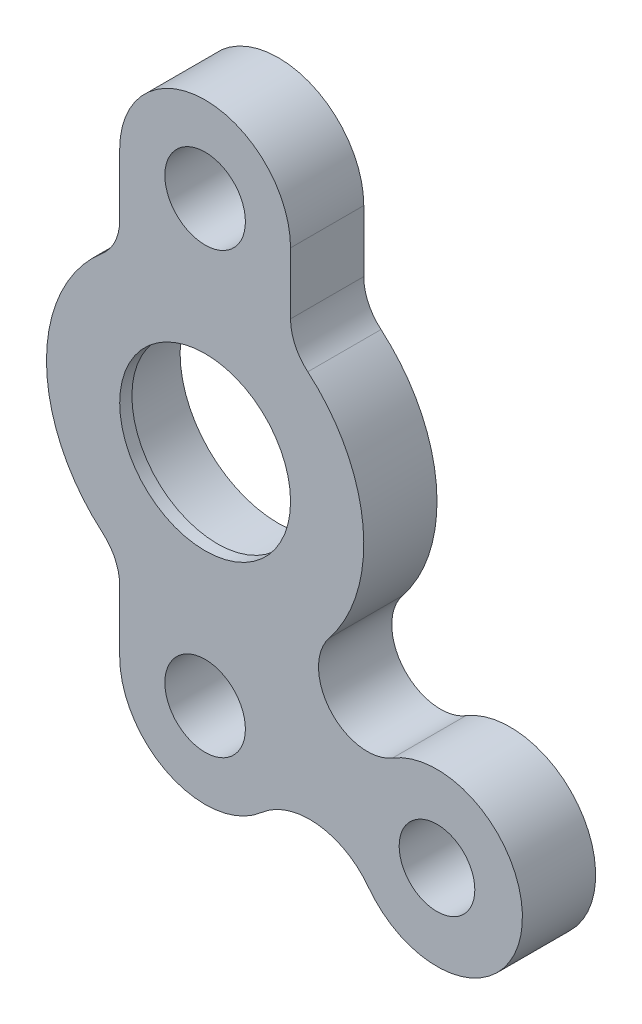
ISO-10303-21;
HEADER;
FILE_DESCRIPTION(('STEP AP214'),'2;1');
FILE_NAME('part.step','',(''),(''),'','','');
FILE_SCHEMA(('AUTOMOTIVE_DESIGN { 1 0 10303 214 1 1 1 1 }'));
ENDSEC;
DATA;
#1=APPLICATION_CONTEXT('core data for automotive mechanical design processes');
#2=APPLICATION_PROTOCOL_DEFINITION('international standard','automotive_design',2000,#1);
#3=PRODUCT_CONTEXT('',#1,'mechanical');
#4=PRODUCT('Part','Part','',(#3));
#5=PRODUCT_RELATED_PRODUCT_CATEGORY('part','',(#4));
#6=PRODUCT_DEFINITION_FORMATION('','',#4);
#7=PRODUCT_DEFINITION_CONTEXT('part definition',#1,'design');
#8=PRODUCT_DEFINITION('design','',#6,#7);
#9=PRODUCT_DEFINITION_SHAPE('','',#8);
#10=(LENGTH_UNIT() NAMED_UNIT(*) SI_UNIT(.MILLI.,.METRE.));
#11=(NAMED_UNIT(*) PLANE_ANGLE_UNIT() SI_UNIT($,.RADIAN.));
#12=(NAMED_UNIT(*) SI_UNIT($,.STERADIAN.) SOLID_ANGLE_UNIT());
#13=UNCERTAINTY_MEASURE_WITH_UNIT(LENGTH_MEASURE(1.E-05),#10,'distance_accuracy_value','');
#14=(GEOMETRIC_REPRESENTATION_CONTEXT(3) GLOBAL_UNCERTAINTY_ASSIGNED_CONTEXT((#13)) GLOBAL_UNIT_ASSIGNED_CONTEXT((#10,
#11,#12)) REPRESENTATION_CONTEXT('',''));
#15=CARTESIAN_POINT('',(0.,0.,0.));
#16=DIRECTION('',(0.,0.,1.));
#17=DIRECTION('',(1.,0.,0.));
#18=AXIS2_PLACEMENT_3D('',#15,#16,#17);
#19=CARTESIAN_POINT('',(0.,0.,29.));
#20=DIRECTION('',(0.,0.,-1.));
#21=DIRECTION('',(-1.,0.,0.));
#22=AXIS2_PLACEMENT_3D('',#19,#20,#21);
#23=CYLINDRICAL_SURFACE('',#22,3.5);
#24=CARTESIAN_POINT('',(0.,0.,28.5));
#25=DIRECTION('',(0.,0.,1.));
#26=DIRECTION('',(0.,-1.,0.));
#27=AXIS2_PLACEMENT_3D('',#24,#25,#26);
#28=CIRCLE('',#27,3.5);
#29=CARTESIAN_POINT('',(0.,-3.5,28.5));
#30=VERTEX_POINT('',#29);
#31=EDGE_CURVE('E210',#30,#30,#28,.T.);
#32=ORIENTED_EDGE('',*,*,#31,.T.);
#33=EDGE_LOOP('',(#32));
#34=FACE_BOUND('',#33,.T.);
#35=CARTESIAN_POINT('',(0.,0.,28.));
#36=DIRECTION('',(0.,0.,-1.));
#37=DIRECTION('',(0.,1.,0.));
#38=AXIS2_PLACEMENT_3D('',#35,#36,#37);
#39=CIRCLE('',#38,3.5);
#40=CARTESIAN_POINT('',(0.,3.5,28.));
#41=VERTEX_POINT('',#40);
#42=EDGE_CURVE('E133',#41,#41,#39,.T.);
#43=ORIENTED_EDGE('',*,*,#42,.T.);
#44=EDGE_LOOP('',(#43));
#45=FACE_BOUND('',#44,.T.);
#46=ADVANCED_FACE('F17',(#34,#45),#23,.F.);
#47=CARTESIAN_POINT('',(-23.2,41.4152455943007,25.5));
#48=DIRECTION('',(0.,0.,-1.));
#49=DIRECTION('',(-1.,0.,0.));
#50=AXIS2_PLACEMENT_3D('',#47,#48,#49);
#51=PLANE('',#50);
#52=CARTESIAN_POINT('',(9.5,-10.,25.5));
#53=DIRECTION('',(0.,0.,-1.));
#54=DIRECTION('',(-1.,0.,0.));
#55=AXIS2_PLACEMENT_3D('',#52,#53,#54);
#56=CIRCLE('',#55,1.55);
#57=CARTESIAN_POINT('',(7.95,-10.,25.5));
#58=VERTEX_POINT('',#57);
#59=EDGE_CURVE('E349',#58,#58,#56,.F.);
#60=ORIENTED_EDGE('',*,*,#59,.T.);
#61=EDGE_LOOP('',(#60));
#62=FACE_BOUND('',#61,.T.);
#63=CARTESIAN_POINT('',(0.,0.,25.5));
#64=DIRECTION('',(0.,0.,-1.));
#65=DIRECTION('',(0.,1.,0.));
#66=AXIS2_PLACEMENT_3D('',#63,#64,#65);
#67=CIRCLE('',#66,4.025);
#68=CARTESIAN_POINT('',(0.,4.025,25.5));
#69=VERTEX_POINT('',#68);
#70=EDGE_CURVE('E139',#69,#69,#67,.T.);
#71=ORIENTED_EDGE('',*,*,#70,.F.);
#72=EDGE_LOOP('',(#71));
#73=FACE_BOUND('',#72,.T.);
#74=CARTESIAN_POINT('',(0.,9.,25.5));
#75=DIRECTION('',(0.,0.,-1.));
#76=DIRECTION('',(-1.,0.,0.));
#77=AXIS2_PLACEMENT_3D('',#74,#75,#76);
#78=CIRCLE('',#77,3.5);
#79=CARTESIAN_POINT('',(3.5,9.,25.5));
#80=VERTEX_POINT('',#79);
#81=CARTESIAN_POINT('',(-3.5,9.,25.5));
#82=VERTEX_POINT('',#81);
#83=EDGE_CURVE('E119',#80,#82,#78,.F.);
#84=ORIENTED_EDGE('',*,*,#83,.F.);
#85=DIRECTION('',(0.,1.,0.));
#86=VECTOR('',#85,1.);
#87=CARTESIAN_POINT('',(3.5,41.4152455943007,25.5));
#88=LINE('',#87,#86);
#89=CARTESIAN_POINT('',(3.5,6.48074069840786,25.5));
#90=VERTEX_POINT('',#89);
#91=EDGE_CURVE('E120',#90,#80,#88,.T.);
#92=ORIENTED_EDGE('',*,*,#91,.F.);
#93=CARTESIAN_POINT('',(5.5,6.48074069840786,25.5));
#94=DIRECTION('',(0.,0.,-1.));
#95=DIRECTION('',(-1.,0.,0.));
#96=AXIS2_PLACEMENT_3D('',#93,#94,#95);
#97=CIRCLE('',#96,2.);
#98=CARTESIAN_POINT('',(4.20588235294118,4.9558605340766,25.5));
#99=VERTEX_POINT('',#98);
#100=EDGE_CURVE('E227',#90,#99,#97,.F.);
#101=ORIENTED_EDGE('',*,*,#100,.T.);
#102=CARTESIAN_POINT('',(0.,0.,25.5));
#103=DIRECTION('',(0.,0.,-1.));
#104=DIRECTION('',(-1.,0.,0.));
#105=AXIS2_PLACEMENT_3D('',#102,#103,#104);
#106=CIRCLE('',#105,6.5);
#107=CARTESIAN_POINT('',(5.08304178098432,-4.05125736688843,25.5));
#108=VERTEX_POINT('',#107);
#109=EDGE_CURVE('E179',#108,#99,#106,.F.);
#110=ORIENTED_EDGE('',*,*,#109,.F.);
#111=CARTESIAN_POINT('',(6.64705463667181,-5.29779809516178,25.5));
#112=DIRECTION('',(0.,0.,-1.));
#113=DIRECTION('',(-1.,0.,0.));
#114=AXIS2_PLACEMENT_3D('',#111,#112,#113);
#115=CIRCLE('',#114,2.);
#116=CARTESIAN_POINT('',(7.6844893142457,-7.00768969692114,25.5));
#117=VERTEX_POINT('',#116);
#118=EDGE_CURVE('E182',#117,#108,#115,.T.);
#119=ORIENTED_EDGE('',*,*,#118,.F.);
#120=CARTESIAN_POINT('',(9.5,-10.,25.5));
#121=DIRECTION('',(0.,0.,-1.));
#122=DIRECTION('',(-1.,0.,0.));
#123=AXIS2_PLACEMENT_3D('',#120,#121,#122);
#124=CIRCLE('',#123,3.5);
#125=CARTESIAN_POINT('',(6.69378934642177,-12.0916935166855,25.5));
#126=VERTEX_POINT('',#125);
#127=EDGE_CURVE('E184',#126,#117,#124,.F.);
#128=ORIENTED_EDGE('',*,*,#127,.F.);
#129=CARTESIAN_POINT('',(4.28846592906901,-13.8845736738445,25.5));
#130=DIRECTION('',(0.,0.,-1.));
#131=DIRECTION('',(-1.,0.,0.));
#132=AXIS2_PLACEMENT_3D('',#129,#130,#131);
#133=CIRCLE('',#132,3.);
#134=CARTESIAN_POINT('',(2.30917396180639,-11.630155055147,25.5));
#135=VERTEX_POINT('',#134);
#136=EDGE_CURVE('E186',#135,#126,#133,.T.);
#137=ORIENTED_EDGE('',*,*,#136,.F.);
#138=CARTESIAN_POINT('',(0.,-9.,25.5));
#139=DIRECTION('',(0.,0.,-1.));
#140=DIRECTION('',(-1.,0.,0.));
#141=AXIS2_PLACEMENT_3D('',#138,#139,#140);
#142=CIRCLE('',#141,3.5);
#143=CARTESIAN_POINT('',(-3.5,-9.,25.5));
#144=VERTEX_POINT('',#143);
#145=EDGE_CURVE('E188',#144,#135,#142,.F.);
#146=ORIENTED_EDGE('',*,*,#145,.F.);
#147=DIRECTION('',(0.,-1.,0.));
#148=VECTOR('',#147,1.);
#149=CARTESIAN_POINT('',(-3.5,41.4152455943007,25.5));
#150=LINE('',#149,#148);
#151=CARTESIAN_POINT('',(-3.5,-6.48074069840787,25.5));
#152=VERTEX_POINT('',#151);
#153=EDGE_CURVE('E190',#152,#144,#150,.T.);
#154=ORIENTED_EDGE('',*,*,#153,.F.);
#155=CARTESIAN_POINT('',(-5.5,-6.48074069840786,25.5));
#156=DIRECTION('',(0.,0.,-1.));
#157=DIRECTION('',(-1.,0.,0.));
#158=AXIS2_PLACEMENT_3D('',#155,#156,#157);
#159=CIRCLE('',#158,2.);
#160=CARTESIAN_POINT('',(-4.20588235294117,-4.9558605340766,25.5));
#161=VERTEX_POINT('',#160);
#162=EDGE_CURVE('E231',#152,#161,#159,.F.);
#163=ORIENTED_EDGE('',*,*,#162,.T.);
#164=CARTESIAN_POINT('',(0.,0.,25.5));
#165=DIRECTION('',(0.,0.,-1.));
#166=DIRECTION('',(-1.,0.,0.));
#167=AXIS2_PLACEMENT_3D('',#164,#165,#166);
#168=CIRCLE('',#167,6.5);
#169=CARTESIAN_POINT('',(-4.20588235294118,4.9558605340766,25.5));
#170=VERTEX_POINT('',#169);
#171=EDGE_CURVE('E192',#170,#161,#168,.F.);
#172=ORIENTED_EDGE('',*,*,#171,.F.);
#173=CARTESIAN_POINT('',(-5.5,6.48074069840786,25.5));
#174=DIRECTION('',(0.,0.,-1.));
#175=DIRECTION('',(-1.,0.,0.));
#176=AXIS2_PLACEMENT_3D('',#173,#174,#175);
#177=CIRCLE('',#176,2.);
#178=CARTESIAN_POINT('',(-3.5,6.48074069840786,25.5));
#179=VERTEX_POINT('',#178);
#180=EDGE_CURVE('E25',#170,#179,#177,.F.);
#181=ORIENTED_EDGE('',*,*,#180,.T.);
#182=DIRECTION('',(0.,-1.,0.));
#183=VECTOR('',#182,1.);
#184=CARTESIAN_POINT('',(-3.50000000000006,41.4152455943007,25.5));
#185=LINE('',#184,#183);
#186=EDGE_CURVE('E195',#82,#179,#185,.T.);
#187=ORIENTED_EDGE('',*,*,#186,.F.);
#188=EDGE_LOOP('',(#84,#92,#101,#110,#119,#128,#137,#146,#154,#163,#172,#181,#187));
#189=FACE_BOUND('',#188,.T.);
#190=CARTESIAN_POINT('',(0.,-9.,25.5));
#191=DIRECTION('',(0.,0.,-1.));
#192=DIRECTION('',(-1.,0.,0.));
#193=AXIS2_PLACEMENT_3D('',#190,#191,#192);
#194=CIRCLE('',#193,1.65);
#195=CARTESIAN_POINT('',(-1.65,-9.,25.5));
#196=VERTEX_POINT('',#195);
#197=EDGE_CURVE('E207',#196,#196,#194,.F.);
#198=ORIENTED_EDGE('',*,*,#197,.T.);
#199=EDGE_LOOP('',(#198));
#200=FACE_BOUND('',#199,.T.);
#201=CARTESIAN_POINT('',(0.,9.,25.5));
#202=DIRECTION('',(0.,0.,-1.));
#203=DIRECTION('',(-1.,0.,0.));
#204=AXIS2_PLACEMENT_3D('',#201,#202,#203);
#205=CIRCLE('',#204,1.65);
#206=CARTESIAN_POINT('',(-1.65,9.,25.5));
#207=VERTEX_POINT('',#206);
#208=EDGE_CURVE('E202',#207,#207,#205,.F.);
#209=ORIENTED_EDGE('',*,*,#208,.T.);
#210=EDGE_LOOP('',(#209));
#211=FACE_BOUND('',#210,.T.);
#212=ADVANCED_FACE('F246',(#62,#73,#189,#200,#211),#51,.T.);
#213=CARTESIAN_POINT('',(-23.2,41.4152455943007,28.5));
#214=DIRECTION('',(0.,0.,1.));
#215=DIRECTION('',(0.,-1.,0.));
#216=AXIS2_PLACEMENT_3D('',#213,#214,#215);
#217=PLANE('',#216);
#218=CARTESIAN_POINT('',(9.5,-10.,28.5));
#219=DIRECTION('',(0.,0.,1.));
#220=DIRECTION('',(1.,0.,0.));
#221=AXIS2_PLACEMENT_3D('',#218,#219,#220);
#222=CIRCLE('',#221,1.55);
#223=CARTESIAN_POINT('',(11.05,-10.,28.5));
#224=VERTEX_POINT('',#223);
#225=EDGE_CURVE('E347',#224,#224,#222,.T.);
#226=ORIENTED_EDGE('',*,*,#225,.F.);
#227=EDGE_LOOP('',(#226));
#228=FACE_BOUND('',#227,.T.);
#229=CARTESIAN_POINT('',(0.,9.,28.5));
#230=DIRECTION('',(0.,0.,1.));
#231=DIRECTION('',(1.,0.,0.));
#232=AXIS2_PLACEMENT_3D('',#229,#230,#231);
#233=CIRCLE('',#232,3.5);
#234=CARTESIAN_POINT('',(3.5,9.,28.5));
#235=VERTEX_POINT('',#234);
#236=CARTESIAN_POINT('',(-3.5,9.,28.5));
#237=VERTEX_POINT('',#236);
#238=EDGE_CURVE('E116',#235,#237,#233,.T.);
#239=ORIENTED_EDGE('',*,*,#238,.T.);
#240=DIRECTION('',(0.,-1.,0.));
#241=VECTOR('',#240,1.);
#242=CARTESIAN_POINT('',(-3.5,9.,28.5));
#243=LINE('',#242,#241);
#244=CARTESIAN_POINT('',(-3.5,6.48074069840786,28.5));
#245=VERTEX_POINT('',#244);
#246=EDGE_CURVE('E123',#237,#245,#243,.T.);
#247=ORIENTED_EDGE('',*,*,#246,.T.);
#248=CARTESIAN_POINT('',(-5.5,6.48074069840786,28.5));
#249=DIRECTION('',(0.,0.,1.));
#250=DIRECTION('',(0.,-1.,0.));
#251=AXIS2_PLACEMENT_3D('',#248,#249,#250);
#252=CIRCLE('',#251,2.);
#253=CARTESIAN_POINT('',(-4.20588235294118,4.9558605340766,28.5));
#254=VERTEX_POINT('',#253);
#255=EDGE_CURVE('E11',#245,#254,#252,.F.);
#256=ORIENTED_EDGE('',*,*,#255,.T.);
#257=CARTESIAN_POINT('',(0.,0.,28.5));
#258=DIRECTION('',(0.,0.,1.));
#259=DIRECTION('',(1.,0.,0.));
#260=AXIS2_PLACEMENT_3D('',#257,#258,#259);
#261=CIRCLE('',#260,6.5);
#262=CARTESIAN_POINT('',(-4.20588235294117,-4.9558605340766,28.5));
#263=VERTEX_POINT('',#262);
#264=EDGE_CURVE('E127',#254,#263,#261,.T.);
#265=ORIENTED_EDGE('',*,*,#264,.T.);
#266=CARTESIAN_POINT('',(-5.5,-6.48074069840786,28.5));
#267=DIRECTION('',(0.,0.,1.));
#268=DIRECTION('',(0.,-1.,0.));
#269=AXIS2_PLACEMENT_3D('',#266,#267,#268);
#270=CIRCLE('',#269,2.);
#271=CARTESIAN_POINT('',(-3.5,-6.48074069840786,28.5));
#272=VERTEX_POINT('',#271);
#273=EDGE_CURVE('E233',#263,#272,#270,.F.);
#274=ORIENTED_EDGE('',*,*,#273,.T.);
#275=DIRECTION('',(0.,-1.,0.));
#276=VECTOR('',#275,1.);
#277=CARTESIAN_POINT('',(-3.5,-5.47722557505166,28.5));
#278=LINE('',#277,#276);
#279=CARTESIAN_POINT('',(-3.5,-9.,28.5));
#280=VERTEX_POINT('',#279);
#281=EDGE_CURVE('E144',#272,#280,#278,.T.);
#282=ORIENTED_EDGE('',*,*,#281,.T.);
#283=CARTESIAN_POINT('',(0.,-9.,28.5));
#284=DIRECTION('',(0.,0.,1.));
#285=DIRECTION('',(1.,0.,0.));
#286=AXIS2_PLACEMENT_3D('',#283,#284,#285);
#287=CIRCLE('',#286,3.5);
#288=CARTESIAN_POINT('',(2.30917396180639,-11.630155055147,28.5));
#289=VERTEX_POINT('',#288);
#290=EDGE_CURVE('E146',#280,#289,#287,.T.);
#291=ORIENTED_EDGE('',*,*,#290,.T.);
#292=CARTESIAN_POINT('',(4.28846592906901,-13.8845736738445,28.5));
#293=DIRECTION('',(0.,0.,-1.));
#294=DIRECTION('',(1.,0.,0.));
#295=AXIS2_PLACEMENT_3D('',#292,#293,#294);
#296=CIRCLE('',#295,3.);
#297=CARTESIAN_POINT('',(6.69378934642177,-12.0916935166855,28.5));
#298=VERTEX_POINT('',#297);
#299=EDGE_CURVE('E149',#289,#298,#296,.T.);
#300=ORIENTED_EDGE('',*,*,#299,.T.);
#301=CARTESIAN_POINT('',(9.5,-10.,28.5));
#302=DIRECTION('',(0.,0.,1.));
#303=DIRECTION('',(1.,0.,0.));
#304=AXIS2_PLACEMENT_3D('',#301,#302,#303);
#305=CIRCLE('',#304,3.5);
#306=CARTESIAN_POINT('',(7.6844893142457,-7.00768969692114,28.5));
#307=VERTEX_POINT('',#306);
#308=EDGE_CURVE('E152',#298,#307,#305,.T.);
#309=ORIENTED_EDGE('',*,*,#308,.T.);
#310=CARTESIAN_POINT('',(6.64705463667181,-5.29779809516178,28.5));
#311=DIRECTION('',(0.,0.,-1.));
#312=DIRECTION('',(1.,0.,0.));
#313=AXIS2_PLACEMENT_3D('',#310,#311,#312);
#314=CIRCLE('',#313,2.);
#315=CARTESIAN_POINT('',(5.08304178098432,-4.05125736688843,28.5));
#316=VERTEX_POINT('',#315);
#317=EDGE_CURVE('E155',#307,#316,#314,.T.);
#318=ORIENTED_EDGE('',*,*,#317,.T.);
#319=CARTESIAN_POINT('',(0.,0.,28.5));
#320=DIRECTION('',(0.,0.,1.));
#321=DIRECTION('',(1.,0.,0.));
#322=AXIS2_PLACEMENT_3D('',#319,#320,#321);
#323=CIRCLE('',#322,6.5);
#324=CARTESIAN_POINT('',(4.20588235294118,4.9558605340766,28.5));
#325=VERTEX_POINT('',#324);
#326=EDGE_CURVE('E158',#316,#325,#323,.T.);
#327=ORIENTED_EDGE('',*,*,#326,.T.);
#328=CARTESIAN_POINT('',(5.5,6.48074069840786,28.5));
#329=DIRECTION('',(0.,0.,1.));
#330=DIRECTION('',(0.,-1.,0.));
#331=AXIS2_PLACEMENT_3D('',#328,#329,#330);
#332=CIRCLE('',#331,2.);
#333=CARTESIAN_POINT('',(3.5,6.48074069840786,28.5));
#334=VERTEX_POINT('',#333);
#335=EDGE_CURVE('E229',#325,#334,#332,.F.);
#336=ORIENTED_EDGE('',*,*,#335,.T.);
#337=DIRECTION('',(0.,1.,0.));
#338=VECTOR('',#337,1.);
#339=CARTESIAN_POINT('',(3.5,9.,28.5));
#340=LINE('',#339,#338);
#341=EDGE_CURVE('E132',#334,#235,#340,.T.);
#342=ORIENTED_EDGE('',*,*,#341,.T.);
#343=EDGE_LOOP('',(#239,#247,#256,#265,#274,#282,#291,#300,#309,#318,#327,#336,#342));
#344=FACE_BOUND('',#343,.T.);
#345=CARTESIAN_POINT('',(0.,-9.,28.5));
#346=DIRECTION('',(0.,0.,1.));
#347=DIRECTION('',(1.,0.,0.));
#348=AXIS2_PLACEMENT_3D('',#345,#346,#347);
#349=CIRCLE('',#348,1.65);
#350=CARTESIAN_POINT('',(1.65,-9.,28.5));
#351=VERTEX_POINT('',#350);
#352=EDGE_CURVE('E199',#351,#351,#349,.T.);
#353=ORIENTED_EDGE('',*,*,#352,.F.);
#354=EDGE_LOOP('',(#353));
#355=FACE_BOUND('',#354,.T.);
#356=CARTESIAN_POINT('',(0.,9.,28.5));
#357=DIRECTION('',(0.,0.,1.));
#358=DIRECTION('',(1.,0.,0.));
#359=AXIS2_PLACEMENT_3D('',#356,#357,#358);
#360=CIRCLE('',#359,1.65);
#361=CARTESIAN_POINT('',(1.65,9.,28.5));
#362=VERTEX_POINT('',#361);
#363=EDGE_CURVE('E198',#362,#362,#360,.T.);
#364=ORIENTED_EDGE('',*,*,#363,.F.);
#365=EDGE_LOOP('',(#364));
#366=FACE_BOUND('',#365,.T.);
#367=ORIENTED_EDGE('',*,*,#31,.F.);
#368=EDGE_LOOP('',(#367));
#369=FACE_BOUND('',#368,.T.);
#370=ADVANCED_FACE('F129',(#228,#344,#355,#366,#369),#217,.T.);
#371=CARTESIAN_POINT('',(0.,9.,28.5));
#372=DIRECTION('',(0.,0.,-1.));
#373=DIRECTION('',(-1.,0.,0.));
#374=AXIS2_PLACEMENT_3D('',#371,#372,#373);
#375=CYLINDRICAL_SURFACE('',#374,1.65);
#376=ORIENTED_EDGE('',*,*,#208,.F.);
#377=EDGE_LOOP('',(#376));
#378=FACE_BOUND('',#377,.T.);
#379=ORIENTED_EDGE('',*,*,#363,.T.);
#380=EDGE_LOOP('',(#379));
#381=FACE_BOUND('',#380,.T.);
#382=ADVANCED_FACE('F326',(#378,#381),#375,.F.);
#383=CARTESIAN_POINT('',(0.,-9.,28.5));
#384=DIRECTION('',(0.,0.,-1.));
#385=DIRECTION('',(-1.,0.,0.));
#386=AXIS2_PLACEMENT_3D('',#383,#384,#385);
#387=CYLINDRICAL_SURFACE('',#386,1.65);
#388=ORIENTED_EDGE('',*,*,#197,.F.);
#389=EDGE_LOOP('',(#388));
#390=FACE_BOUND('',#389,.T.);
#391=ORIENTED_EDGE('',*,*,#352,.T.);
#392=EDGE_LOOP('',(#391));
#393=FACE_BOUND('',#392,.T.);
#394=ADVANCED_FACE('F323',(#390,#393),#387,.F.);
#395=CARTESIAN_POINT('',(0.,9.,28.5));
#396=DIRECTION('',(0.,0.,-1.));
#397=DIRECTION('',(-1.,0.,0.));
#398=AXIS2_PLACEMENT_3D('',#395,#396,#397);
#399=CYLINDRICAL_SURFACE('',#398,3.5);
#400=ORIENTED_EDGE('',*,*,#83,.T.);
#401=DIRECTION('',(0.,0.,-1.));
#402=VECTOR('',#401,1.);
#403=CARTESIAN_POINT('',(-3.5,9.,28.5));
#404=LINE('',#403,#402);
#405=EDGE_CURVE('E112',#237,#82,#404,.T.);
#406=ORIENTED_EDGE('',*,*,#405,.F.);
#407=ORIENTED_EDGE('',*,*,#238,.F.);
#408=DIRECTION('',(0.,0.,-1.));
#409=VECTOR('',#408,1.);
#410=CARTESIAN_POINT('',(3.5,9.,28.5));
#411=LINE('',#410,#409);
#412=EDGE_CURVE('E162',#235,#80,#411,.T.);
#413=ORIENTED_EDGE('',*,*,#412,.T.);
#414=EDGE_LOOP('',(#400,#406,#407,#413));
#415=FACE_BOUND('',#414,.T.);
#416=ADVANCED_FACE('F113',(#415),#399,.T.);
#417=CARTESIAN_POINT('',(-3.5,9.,28.5));
#418=DIRECTION('',(1.,0.,0.));
#419=DIRECTION('',(0.,1.,0.));
#420=AXIS2_PLACEMENT_3D('',#417,#418,#419);
#421=PLANE('',#420);
#422=ORIENTED_EDGE('',*,*,#186,.T.);
#423=DIRECTION('',(0.,0.,1.));
#424=VECTOR('',#423,1.);
#425=CARTESIAN_POINT('',(-3.5,6.48074069840786,28.5));
#426=LINE('',#425,#424);
#427=EDGE_CURVE('E32',#179,#245,#426,.T.);
#428=ORIENTED_EDGE('',*,*,#427,.T.);
#429=ORIENTED_EDGE('',*,*,#246,.F.);
#430=ORIENTED_EDGE('',*,*,#405,.T.);
#431=EDGE_LOOP('',(#422,#428,#429,#430));
#432=FACE_BOUND('',#431,.T.);
#433=ADVANCED_FACE('F124',(#432),#421,.F.);
#434=CARTESIAN_POINT('',(0.,0.,28.5));
#435=DIRECTION('',(0.,0.,-1.));
#436=DIRECTION('',(-1.,0.,0.));
#437=AXIS2_PLACEMENT_3D('',#434,#435,#436);
#438=CYLINDRICAL_SURFACE('',#437,6.5);
#439=ORIENTED_EDGE('',*,*,#171,.T.);
#440=DIRECTION('',(0.,0.,-1.));
#441=VECTOR('',#440,1.);
#442=CARTESIAN_POINT('',(-4.20588235294117,-4.9558605340766,28.5));
#443=LINE('',#442,#441);
#444=EDGE_CURVE('E224',#161,#263,#443,.F.);
#445=ORIENTED_EDGE('',*,*,#444,.T.);
#446=ORIENTED_EDGE('',*,*,#264,.F.);
#447=DIRECTION('',(0.,0.,-1.));
#448=VECTOR('',#447,1.);
#449=CARTESIAN_POINT('',(-4.20588235294118,4.9558605340766,28.5));
#450=LINE('',#449,#448);
#451=EDGE_CURVE('E221',#254,#170,#450,.T.);
#452=ORIENTED_EDGE('',*,*,#451,.T.);
#453=EDGE_LOOP('',(#439,#445,#446,#452));
#454=FACE_BOUND('',#453,.T.);
#455=ADVANCED_FACE('F250',(#454),#438,.T.);
#456=CARTESIAN_POINT('',(-3.5,-5.47722557505166,28.5));
#457=DIRECTION('',(1.,0.,0.));
#458=DIRECTION('',(0.,0.,-1.));
#459=AXIS2_PLACEMENT_3D('',#456,#457,#458);
#460=PLANE('',#459);
#461=ORIENTED_EDGE('',*,*,#281,.F.);
#462=DIRECTION('',(0.,0.,1.));
#463=VECTOR('',#462,1.);
#464=CARTESIAN_POINT('',(-3.5,-6.48074069840786,25.5));
#465=LINE('',#464,#463);
#466=EDGE_CURVE('E218',#272,#152,#465,.F.);
#467=ORIENTED_EDGE('',*,*,#466,.T.);
#468=ORIENTED_EDGE('',*,*,#153,.T.);
#469=DIRECTION('',(0.,0.,-1.));
#470=VECTOR('',#469,1.);
#471=CARTESIAN_POINT('',(-3.5,-9.,28.5));
#472=LINE('',#471,#470);
#473=EDGE_CURVE('E121',#280,#144,#472,.T.);
#474=ORIENTED_EDGE('',*,*,#473,.F.);
#475=EDGE_LOOP('',(#461,#467,#468,#474));
#476=FACE_BOUND('',#475,.T.);
#477=ADVANCED_FACE('F242',(#476),#460,.F.);
#478=CARTESIAN_POINT('',(0.,-9.,28.5));
#479=DIRECTION('',(0.,0.,-1.));
#480=DIRECTION('',(-1.,0.,0.));
#481=AXIS2_PLACEMENT_3D('',#478,#479,#480);
#482=CYLINDRICAL_SURFACE('',#481,3.5);
#483=ORIENTED_EDGE('',*,*,#145,.T.);
#484=DIRECTION('',(0.,0.,-1.));
#485=VECTOR('',#484,1.);
#486=CARTESIAN_POINT('',(2.30917396180639,-11.630155055147,28.5));
#487=LINE('',#486,#485);
#488=EDGE_CURVE('E173',#289,#135,#487,.T.);
#489=ORIENTED_EDGE('',*,*,#488,.F.);
#490=ORIENTED_EDGE('',*,*,#290,.F.);
#491=ORIENTED_EDGE('',*,*,#473,.T.);
#492=EDGE_LOOP('',(#483,#489,#490,#491));
#493=FACE_BOUND('',#492,.T.);
#494=ADVANCED_FACE('F305',(#493),#482,.T.);
#495=CARTESIAN_POINT('',(4.28846592906901,-13.8845736738445,28.5));
#496=DIRECTION('',(0.,0.,-1.));
#497=DIRECTION('',(-1.,0.,0.));
#498=AXIS2_PLACEMENT_3D('',#495,#496,#497);
#499=CYLINDRICAL_SURFACE('',#498,3.);
#500=ORIENTED_EDGE('',*,*,#136,.T.);
#501=DIRECTION('',(0.,0.,-1.));
#502=VECTOR('',#501,1.);
#503=CARTESIAN_POINT('',(6.69378934642177,-12.0916935166855,28.5));
#504=LINE('',#503,#502);
#505=EDGE_CURVE('E170',#298,#126,#504,.T.);
#506=ORIENTED_EDGE('',*,*,#505,.F.);
#507=ORIENTED_EDGE('',*,*,#299,.F.);
#508=ORIENTED_EDGE('',*,*,#488,.T.);
#509=EDGE_LOOP('',(#500,#506,#507,#508));
#510=FACE_BOUND('',#509,.T.);
#511=ADVANCED_FACE('F303',(#510),#499,.F.);
#512=CARTESIAN_POINT('',(9.5,-10.,28.5));
#513=DIRECTION('',(0.,0.,-1.));
#514=DIRECTION('',(-1.,0.,0.));
#515=AXIS2_PLACEMENT_3D('',#512,#513,#514);
#516=CYLINDRICAL_SURFACE('',#515,3.5);
#517=ORIENTED_EDGE('',*,*,#127,.T.);
#518=DIRECTION('',(0.,0.,-1.));
#519=VECTOR('',#518,1.);
#520=CARTESIAN_POINT('',(7.6844893142457,-7.00768969692114,28.5));
#521=LINE('',#520,#519);
#522=EDGE_CURVE('E167',#307,#117,#521,.T.);
#523=ORIENTED_EDGE('',*,*,#522,.F.);
#524=ORIENTED_EDGE('',*,*,#308,.F.);
#525=ORIENTED_EDGE('',*,*,#505,.T.);
#526=EDGE_LOOP('',(#517,#523,#524,#525));
#527=FACE_BOUND('',#526,.T.);
#528=ADVANCED_FACE('F299',(#527),#516,.T.);
#529=CARTESIAN_POINT('',(6.64705463667181,-5.29779809516178,28.5));
#530=DIRECTION('',(0.,0.,-1.));
#531=DIRECTION('',(-1.,0.,0.));
#532=AXIS2_PLACEMENT_3D('',#529,#530,#531);
#533=CYLINDRICAL_SURFACE('',#532,2.);
#534=ORIENTED_EDGE('',*,*,#118,.T.);
#535=DIRECTION('',(0.,0.,-1.));
#536=VECTOR('',#535,1.);
#537=CARTESIAN_POINT('',(5.08304178098432,-4.05125736688843,28.5));
#538=LINE('',#537,#536);
#539=EDGE_CURVE('E164',#316,#108,#538,.T.);
#540=ORIENTED_EDGE('',*,*,#539,.F.);
#541=ORIENTED_EDGE('',*,*,#317,.F.);
#542=ORIENTED_EDGE('',*,*,#522,.T.);
#543=EDGE_LOOP('',(#534,#540,#541,#542));
#544=FACE_BOUND('',#543,.T.);
#545=ADVANCED_FACE('F295',(#544),#533,.F.);
#546=CARTESIAN_POINT('',(0.,0.,28.5));
#547=DIRECTION('',(0.,0.,-1.));
#548=DIRECTION('',(-1.,0.,0.));
#549=AXIS2_PLACEMENT_3D('',#546,#547,#548);
#550=CYLINDRICAL_SURFACE('',#549,6.5);
#551=ORIENTED_EDGE('',*,*,#109,.T.);
#552=DIRECTION('',(0.,0.,-1.));
#553=VECTOR('',#552,1.);
#554=CARTESIAN_POINT('',(4.20588235294118,4.9558605340766,28.5));
#555=LINE('',#554,#553);
#556=EDGE_CURVE('E216',#99,#325,#555,.F.);
#557=ORIENTED_EDGE('',*,*,#556,.T.);
#558=ORIENTED_EDGE('',*,*,#326,.F.);
#559=ORIENTED_EDGE('',*,*,#539,.T.);
#560=EDGE_LOOP('',(#551,#557,#558,#559));
#561=FACE_BOUND('',#560,.T.);
#562=ADVANCED_FACE('F292',(#561),#550,.T.);
#563=CARTESIAN_POINT('',(3.5,9.,28.5));
#564=DIRECTION('',(-1.,0.,0.));
#565=DIRECTION('',(0.,-1.,0.));
#566=AXIS2_PLACEMENT_3D('',#563,#564,#565);
#567=PLANE('',#566);
#568=ORIENTED_EDGE('',*,*,#341,.F.);
#569=DIRECTION('',(0.,0.,1.));
#570=VECTOR('',#569,1.);
#571=CARTESIAN_POINT('',(3.5,6.48074069840786,25.5));
#572=LINE('',#571,#570);
#573=EDGE_CURVE('E212',#334,#90,#572,.F.);
#574=ORIENTED_EDGE('',*,*,#573,.T.);
#575=ORIENTED_EDGE('',*,*,#91,.T.);
#576=ORIENTED_EDGE('',*,*,#412,.F.);
#577=EDGE_LOOP('',(#568,#574,#575,#576));
#578=FACE_BOUND('',#577,.T.);
#579=ADVANCED_FACE('F287',(#578),#567,.F.);
#580=CARTESIAN_POINT('',(0.,0.,28.));
#581=DIRECTION('',(0.,0.,-1.));
#582=DIRECTION('',(0.,1.,0.));
#583=AXIS2_PLACEMENT_3D('',#580,#581,#582);
#584=CYLINDRICAL_SURFACE('',#583,4.025);
#585=CARTESIAN_POINT('',(0.,0.,28.));
#586=DIRECTION('',(0.,0.,-1.));
#587=DIRECTION('',(0.,1.,0.));
#588=AXIS2_PLACEMENT_3D('',#585,#586,#587);
#589=CIRCLE('',#588,4.025);
#590=CARTESIAN_POINT('',(0.,4.025,28.));
#591=VERTEX_POINT('',#590);
#592=EDGE_CURVE('E136',#591,#591,#589,.T.);
#593=ORIENTED_EDGE('',*,*,#592,.F.);
#594=EDGE_LOOP('',(#593));
#595=FACE_BOUND('',#594,.T.);
#596=ORIENTED_EDGE('',*,*,#70,.T.);
#597=EDGE_LOOP('',(#596));
#598=FACE_BOUND('',#597,.T.);
#599=ADVANCED_FACE('F359',(#595,#598),#584,.F.);
#600=CARTESIAN_POINT('',(0.,0.,28.));
#601=DIRECTION('',(0.,0.,-1.));
#602=DIRECTION('',(0.,1.,0.));
#603=AXIS2_PLACEMENT_3D('',#600,#601,#602);
#604=PLANE('',#603);
#605=ORIENTED_EDGE('',*,*,#42,.F.);
#606=EDGE_LOOP('',(#605));
#607=FACE_BOUND('',#606,.T.);
#608=ORIENTED_EDGE('',*,*,#592,.T.);
#609=EDGE_LOOP('',(#608));
#610=FACE_BOUND('',#609,.T.);
#611=ADVANCED_FACE('F279',(#607,#610),#604,.T.);
#612=CARTESIAN_POINT('',(9.5,-10.,28.5));
#613=DIRECTION('',(0.,0.,-1.));
#614=DIRECTION('',(-1.,0.,0.));
#615=AXIS2_PLACEMENT_3D('',#612,#613,#614);
#616=CYLINDRICAL_SURFACE('',#615,1.55);
#617=ORIENTED_EDGE('',*,*,#59,.F.);
#618=EDGE_LOOP('',(#617));
#619=FACE_BOUND('',#618,.T.);
#620=ORIENTED_EDGE('',*,*,#225,.T.);
#621=EDGE_LOOP('',(#620));
#622=FACE_BOUND('',#621,.T.);
#623=ADVANCED_FACE('F273',(#619,#622),#616,.F.);
#624=CARTESIAN_POINT('',(5.5,6.48074069840786,28.5));
#625=DIRECTION('',(0.,0.,-1.));
#626=DIRECTION('',(-1.,0.,0.));
#627=AXIS2_PLACEMENT_3D('',#624,#625,#626);
#628=CYLINDRICAL_SURFACE('',#627,2.);
#629=ORIENTED_EDGE('',*,*,#335,.F.);
#630=ORIENTED_EDGE('',*,*,#556,.F.);
#631=ORIENTED_EDGE('',*,*,#100,.F.);
#632=ORIENTED_EDGE('',*,*,#573,.F.);
#633=EDGE_LOOP('',(#629,#630,#631,#632));
#634=FACE_BOUND('',#633,.T.);
#635=ADVANCED_FACE('F259',(#634),#628,.F.);
#636=CARTESIAN_POINT('',(-5.5,-6.48074069840786,28.5));
#637=DIRECTION('',(0.,0.,-1.));
#638=DIRECTION('',(-1.,0.,0.));
#639=AXIS2_PLACEMENT_3D('',#636,#637,#638);
#640=CYLINDRICAL_SURFACE('',#639,2.);
#641=ORIENTED_EDGE('',*,*,#273,.F.);
#642=ORIENTED_EDGE('',*,*,#444,.F.);
#643=ORIENTED_EDGE('',*,*,#162,.F.);
#644=ORIENTED_EDGE('',*,*,#466,.F.);
#645=EDGE_LOOP('',(#641,#642,#643,#644));
#646=FACE_BOUND('',#645,.T.);
#647=ADVANCED_FACE('F245',(#646),#640,.F.);
#648=CARTESIAN_POINT('',(-5.5,6.48074069840786,28.5));
#649=DIRECTION('',(0.,0.,-1.));
#650=DIRECTION('',(-1.,0.,0.));
#651=AXIS2_PLACEMENT_3D('',#648,#649,#650);
#652=CYLINDRICAL_SURFACE('',#651,2.);
#653=ORIENTED_EDGE('',*,*,#255,.F.);
#654=ORIENTED_EDGE('',*,*,#427,.F.);
#655=ORIENTED_EDGE('',*,*,#180,.F.);
#656=ORIENTED_EDGE('',*,*,#451,.F.);
#657=EDGE_LOOP('',(#653,#654,#655,#656));
#658=FACE_BOUND('',#657,.T.);
#659=ADVANCED_FACE('F19',(#658),#652,.F.);
#660=CLOSED_SHELL('',(#46,#212,#370,#382,#394,#416,#433,#455,#477,#494,#511,#528,#545,#562,#579,
#599,#611,#623,#635,#647,#659));
#661=MANIFOLD_SOLID_BREP('B1',#660);
#662=ADVANCED_BREP_SHAPE_REPRESENTATION('',(#18,#661),#14);
#663=SHAPE_DEFINITION_REPRESENTATION(#9,#662);
ENDSEC;
END-ISO-10303-21;
